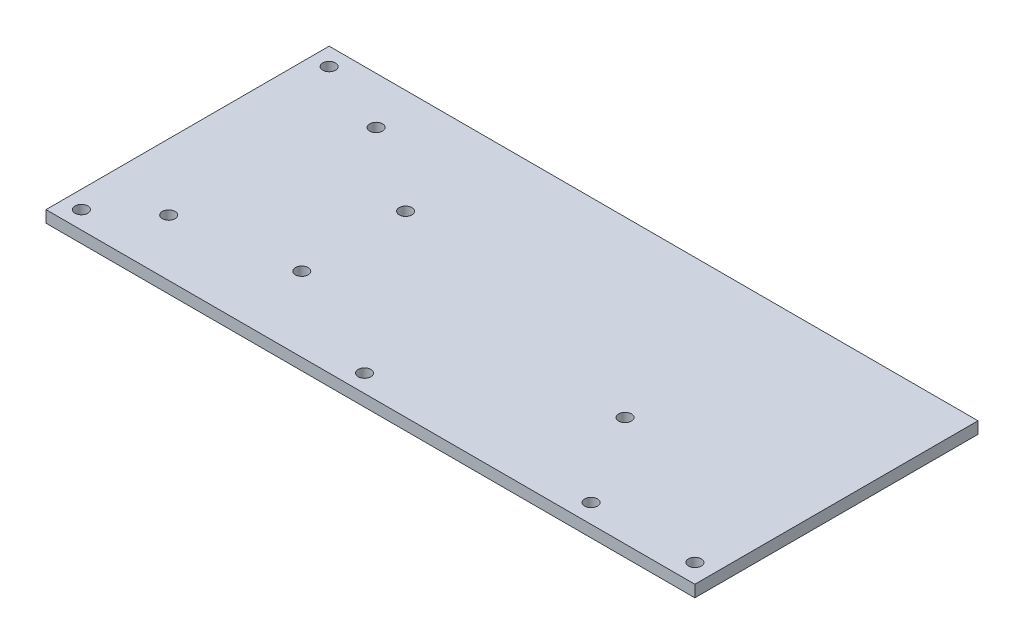
ISO-10303-21;
HEADER;
FILE_DESCRIPTION(('STEP AP214'),'2;1');
FILE_NAME('part.step','',(''),(''),'','','');
FILE_SCHEMA(('AUTOMOTIVE_DESIGN { 1 0 10303 214 1 1 1 1 }'));
ENDSEC;
DATA;
#1=APPLICATION_CONTEXT('core data for automotive mechanical design processes');
#2=APPLICATION_PROTOCOL_DEFINITION('international standard','automotive_design',2000,#1);
#3=PRODUCT_CONTEXT('',#1,'mechanical');
#4=PRODUCT('Part','Part','',(#3));
#5=PRODUCT_RELATED_PRODUCT_CATEGORY('part','',(#4));
#6=PRODUCT_DEFINITION_FORMATION('','',#4);
#7=PRODUCT_DEFINITION_CONTEXT('part definition',#1,'design');
#8=PRODUCT_DEFINITION('design','',#6,#7);
#9=PRODUCT_DEFINITION_SHAPE('','',#8);
#10=(LENGTH_UNIT() NAMED_UNIT(*) SI_UNIT(.MILLI.,.METRE.));
#11=(NAMED_UNIT(*) PLANE_ANGLE_UNIT() SI_UNIT($,.RADIAN.));
#12=(NAMED_UNIT(*) SI_UNIT($,.STERADIAN.) SOLID_ANGLE_UNIT());
#13=UNCERTAINTY_MEASURE_WITH_UNIT(LENGTH_MEASURE(1.E-05),#10,'distance_accuracy_value','');
#14=(GEOMETRIC_REPRESENTATION_CONTEXT(3) GLOBAL_UNCERTAINTY_ASSIGNED_CONTEXT((#13)) GLOBAL_UNIT_ASSIGNED_CONTEXT((#10,
#11,#12)) REPRESENTATION_CONTEXT('',''));
#15=CARTESIAN_POINT('',(0.,0.,0.));
#16=DIRECTION('',(0.,0.,1.));
#17=DIRECTION('',(1.,0.,0.));
#18=AXIS2_PLACEMENT_3D('',#15,#16,#17);
#19=CARTESIAN_POINT('',(87.3125,3.175,38.1));
#20=DIRECTION('',(-1.,0.,0.));
#21=DIRECTION('',(0.,0.,1.));
#22=AXIS2_PLACEMENT_3D('',#19,#20,#21);
#23=PLANE('',#22);
#24=DIRECTION('',(0.,0.,-1.));
#25=VECTOR('',#24,1.);
#26=CARTESIAN_POINT('',(87.3125,0.,38.1));
#27=LINE('',#26,#25);
#28=CARTESIAN_POINT('',(87.3125,0.,38.1));
#29=VERTEX_POINT('',#28);
#30=CARTESIAN_POINT('',(87.3125,0.,-38.1));
#31=VERTEX_POINT('',#30);
#32=EDGE_CURVE('E97',#29,#31,#27,.T.);
#33=ORIENTED_EDGE('',*,*,#32,.T.);
#34=DIRECTION('',(0.,-1.,0.));
#35=VECTOR('',#34,1.);
#36=CARTESIAN_POINT('',(87.3125,3.175,-38.1));
#37=LINE('',#36,#35);
#38=CARTESIAN_POINT('',(87.3125,3.175,-38.1));
#39=VERTEX_POINT('',#38);
#40=EDGE_CURVE('E11',#39,#31,#37,.T.);
#41=ORIENTED_EDGE('',*,*,#40,.F.);
#42=DIRECTION('',(0.,0.,-1.));
#43=VECTOR('',#42,1.);
#44=CARTESIAN_POINT('',(87.3125,3.175,38.1));
#45=LINE('',#44,#43);
#46=CARTESIAN_POINT('',(87.3125,3.175,38.1));
#47=VERTEX_POINT('',#46);
#48=EDGE_CURVE('E85',#47,#39,#45,.T.);
#49=ORIENTED_EDGE('',*,*,#48,.F.);
#50=DIRECTION('',(0.,-1.,0.));
#51=VECTOR('',#50,1.);
#52=CARTESIAN_POINT('',(87.3125,3.175,38.1));
#53=LINE('',#52,#51);
#54=EDGE_CURVE('E93',#47,#29,#53,.T.);
#55=ORIENTED_EDGE('',*,*,#54,.T.);
#56=EDGE_LOOP('',(#33,#41,#49,#55));
#57=FACE_BOUND('',#56,.T.);
#58=ADVANCED_FACE('F34',(#57),#23,.F.);
#59=CARTESIAN_POINT('',(-87.3125,3.175,-38.1));
#60=DIRECTION('',(0.,0.,1.));
#61=DIRECTION('',(1.,0.,0.));
#62=AXIS2_PLACEMENT_3D('',#59,#60,#61);
#63=PLANE('',#62);
#64=DIRECTION('',(-1.,0.,0.));
#65=VECTOR('',#64,1.);
#66=CARTESIAN_POINT('',(-87.3125,0.,-38.1));
#67=LINE('',#66,#65);
#68=CARTESIAN_POINT('',(-87.3125,0.,-38.1));
#69=VERTEX_POINT('',#68);
#70=EDGE_CURVE('E89',#31,#69,#67,.T.);
#71=ORIENTED_EDGE('',*,*,#70,.T.);
#72=DIRECTION('',(0.,-1.,0.));
#73=VECTOR('',#72,1.);
#74=CARTESIAN_POINT('',(-87.3125,3.175,-38.1));
#75=LINE('',#74,#73);
#76=CARTESIAN_POINT('',(-87.3125,3.175,-38.1));
#77=VERTEX_POINT('',#76);
#78=EDGE_CURVE('E42',#77,#69,#75,.T.);
#79=ORIENTED_EDGE('',*,*,#78,.F.);
#80=DIRECTION('',(-1.,0.,0.));
#81=VECTOR('',#80,1.);
#82=CARTESIAN_POINT('',(-87.3125,3.175,-38.1));
#83=LINE('',#82,#81);
#84=EDGE_CURVE('E80',#39,#77,#83,.T.);
#85=ORIENTED_EDGE('',*,*,#84,.F.);
#86=ORIENTED_EDGE('',*,*,#40,.T.);
#87=EDGE_LOOP('',(#71,#79,#85,#86));
#88=FACE_BOUND('',#87,.T.);
#89=ADVANCED_FACE('F88',(#88),#63,.F.);
#90=CARTESIAN_POINT('',(-87.3125,3.175,38.1));
#91=DIRECTION('',(1.,0.,0.));
#92=DIRECTION('',(0.,0.,-1.));
#93=AXIS2_PLACEMENT_3D('',#90,#91,#92);
#94=PLANE('',#93);
#95=DIRECTION('',(0.,0.,1.));
#96=VECTOR('',#95,1.);
#97=CARTESIAN_POINT('',(-87.3125,0.,38.1));
#98=LINE('',#97,#96);
#99=CARTESIAN_POINT('',(-87.3125,0.,38.1));
#100=VERTEX_POINT('',#99);
#101=EDGE_CURVE('E67',#69,#100,#98,.T.);
#102=ORIENTED_EDGE('',*,*,#101,.T.);
#103=DIRECTION('',(0.,-1.,0.));
#104=VECTOR('',#103,1.);
#105=CARTESIAN_POINT('',(-87.3125,3.175,38.1));
#106=LINE('',#105,#104);
#107=CARTESIAN_POINT('',(-87.3125,3.175,38.1));
#108=VERTEX_POINT('',#107);
#109=EDGE_CURVE('E90',#108,#100,#106,.T.);
#110=ORIENTED_EDGE('',*,*,#109,.F.);
#111=DIRECTION('',(0.,0.,1.));
#112=VECTOR('',#111,1.);
#113=CARTESIAN_POINT('',(-87.3125,3.175,38.1));
#114=LINE('',#113,#112);
#115=EDGE_CURVE('E83',#77,#108,#114,.T.);
#116=ORIENTED_EDGE('',*,*,#115,.F.);
#117=ORIENTED_EDGE('',*,*,#78,.T.);
#118=EDGE_LOOP('',(#102,#110,#116,#117));
#119=FACE_BOUND('',#118,.T.);
#120=ADVANCED_FACE('F91',(#119),#94,.F.);
#121=CARTESIAN_POINT('',(-87.3125,3.175,38.1));
#122=DIRECTION('',(0.,0.,-1.));
#123=DIRECTION('',(-1.,0.,0.));
#124=AXIS2_PLACEMENT_3D('',#121,#122,#123);
#125=PLANE('',#124);
#126=DIRECTION('',(1.,0.,0.));
#127=VECTOR('',#126,1.);
#128=CARTESIAN_POINT('',(-87.3125,0.,38.1));
#129=LINE('',#128,#127);
#130=EDGE_CURVE('E73',#100,#29,#129,.T.);
#131=ORIENTED_EDGE('',*,*,#130,.T.);
#132=ORIENTED_EDGE('',*,*,#54,.F.);
#133=DIRECTION('',(1.,0.,0.));
#134=VECTOR('',#133,1.);
#135=CARTESIAN_POINT('',(-87.3125,3.175,38.1));
#136=LINE('',#135,#134);
#137=EDGE_CURVE('E50',#108,#47,#136,.T.);
#138=ORIENTED_EDGE('',*,*,#137,.F.);
#139=ORIENTED_EDGE('',*,*,#109,.T.);
#140=EDGE_LOOP('',(#131,#132,#138,#139));
#141=FACE_BOUND('',#140,.T.);
#142=ADVANCED_FACE('F105',(#141),#125,.F.);
#143=CARTESIAN_POINT('',(0.,3.175,0.));
#144=DIRECTION('',(0.,-1.,0.));
#145=DIRECTION('',(0.,0.,-1.));
#146=AXIS2_PLACEMENT_3D('',#143,#144,#145);
#147=PLANE('',#146);
#148=CARTESIAN_POINT('',(39.0525,3.175,8.636));
#149=DIRECTION('',(0.,1.,0.));
#150=DIRECTION('',(0.,0.,1.));
#151=AXIS2_PLACEMENT_3D('',#148,#149,#150);
#152=CIRCLE('',#151,1.7145);
#153=CARTESIAN_POINT('',(39.0525,3.175,10.3505));
#154=VERTEX_POINT('',#153);
#155=EDGE_CURVE('E162',#154,#154,#152,.T.);
#156=ORIENTED_EDGE('',*,*,#155,.F.);
#157=EDGE_LOOP('',(#156));
#158=FACE_BOUND('',#157,.T.);
#159=CARTESIAN_POINT('',(54.2925,3.175,33.02));
#160=DIRECTION('',(0.,1.,0.));
#161=DIRECTION('',(0.,0.,1.));
#162=AXIS2_PLACEMENT_3D('',#159,#160,#161);
#163=CIRCLE('',#162,1.7145);
#164=CARTESIAN_POINT('',(54.2925,3.175,34.7345));
#165=VERTEX_POINT('',#164);
#166=EDGE_CURVE('E156',#165,#165,#163,.T.);
#167=ORIENTED_EDGE('',*,*,#166,.F.);
#168=EDGE_LOOP('',(#167));
#169=FACE_BOUND('',#168,.T.);
#170=CARTESIAN_POINT('',(82.2325,3.175,33.02));
#171=DIRECTION('',(0.,1.,0.));
#172=DIRECTION('',(0.,0.,1.));
#173=AXIS2_PLACEMENT_3D('',#170,#171,#172);
#174=CIRCLE('',#173,1.7145);
#175=CARTESIAN_POINT('',(82.2325,3.175,34.7345));
#176=VERTEX_POINT('',#175);
#177=EDGE_CURVE('E150',#176,#176,#174,.T.);
#178=ORIENTED_EDGE('',*,*,#177,.F.);
#179=EDGE_LOOP('',(#178));
#180=FACE_BOUND('',#179,.T.);
#181=CARTESIAN_POINT('',(-62.0395,3.175,-25.4762));
#182=DIRECTION('',(0.,1.,0.));
#183=DIRECTION('',(0.,0.,1.));
#184=AXIS2_PLACEMENT_3D('',#181,#182,#183);
#185=CIRCLE('',#184,1.7145);
#186=CARTESIAN_POINT('',(-62.0395,3.175,-23.7617));
#187=VERTEX_POINT('',#186);
#188=EDGE_CURVE('E144',#187,#187,#185,.T.);
#189=ORIENTED_EDGE('',*,*,#188,.F.);
#190=EDGE_LOOP('',(#189));
#191=FACE_BOUND('',#190,.T.);
#192=CARTESIAN_POINT('',(-69.5325,3.175,22.86));
#193=DIRECTION('',(0.,1.,0.));
#194=DIRECTION('',(0.,0.,1.));
#195=AXIS2_PLACEMENT_3D('',#192,#193,#194);
#196=CIRCLE('',#195,1.7145);
#197=CARTESIAN_POINT('',(-69.5325,3.175,24.5745));
#198=VERTEX_POINT('',#197);
#199=EDGE_CURVE('E138',#198,#198,#196,.T.);
#200=ORIENTED_EDGE('',*,*,#199,.F.);
#201=EDGE_LOOP('',(#200));
#202=FACE_BOUND('',#201,.T.);
#203=CARTESIAN_POINT('',(-38.5445,3.175,-9.906));
#204=DIRECTION('',(0.,1.,0.));
#205=DIRECTION('',(0.,0.,1.));
#206=AXIS2_PLACEMENT_3D('',#203,#204,#205);
#207=CIRCLE('',#206,1.7145);
#208=CARTESIAN_POINT('',(-38.5445,3.175,-8.1915));
#209=VERTEX_POINT('',#208);
#210=EDGE_CURVE('E132',#209,#209,#207,.T.);
#211=ORIENTED_EDGE('',*,*,#210,.F.);
#212=EDGE_LOOP('',(#211));
#213=FACE_BOUND('',#212,.T.);
#214=CARTESIAN_POINT('',(-38.5445,3.175,18.034));
#215=DIRECTION('',(0.,1.,0.));
#216=DIRECTION('',(0.,0.,1.));
#217=AXIS2_PLACEMENT_3D('',#214,#215,#216);
#218=CIRCLE('',#217,1.7145);
#219=CARTESIAN_POINT('',(-38.5445,3.175,19.7485));
#220=VERTEX_POINT('',#219);
#221=EDGE_CURVE('E126',#220,#220,#218,.T.);
#222=ORIENTED_EDGE('',*,*,#221,.F.);
#223=EDGE_LOOP('',(#222));
#224=FACE_BOUND('',#223,.T.);
#225=CARTESIAN_POINT('',(-6.35000000000004,3.175,33.3375));
#226=DIRECTION('',(0.,1.,0.));
#227=DIRECTION('',(0.,0.,1.));
#228=AXIS2_PLACEMENT_3D('',#225,#226,#227);
#229=CIRCLE('',#228,1.7145);
#230=CARTESIAN_POINT('',(-6.35000000000004,3.175,35.052));
#231=VERTEX_POINT('',#230);
#232=EDGE_CURVE('E120',#231,#231,#229,.T.);
#233=ORIENTED_EDGE('',*,*,#232,.F.);
#234=EDGE_LOOP('',(#233));
#235=FACE_BOUND('',#234,.T.);
#236=CARTESIAN_POINT('',(-82.55,3.175,33.3375));
#237=DIRECTION('',(0.,1.,0.));
#238=DIRECTION('',(0.,0.,1.));
#239=AXIS2_PLACEMENT_3D('',#236,#237,#238);
#240=CIRCLE('',#239,1.7145);
#241=CARTESIAN_POINT('',(-82.55,3.175,35.052));
#242=VERTEX_POINT('',#241);
#243=EDGE_CURVE('E114',#242,#242,#240,.T.);
#244=ORIENTED_EDGE('',*,*,#243,.F.);
#245=EDGE_LOOP('',(#244));
#246=FACE_BOUND('',#245,.T.);
#247=CARTESIAN_POINT('',(-82.55,3.175,-33.3375));
#248=DIRECTION('',(0.,1.,0.));
#249=DIRECTION('',(0.,0.,1.));
#250=AXIS2_PLACEMENT_3D('',#247,#248,#249);
#251=CIRCLE('',#250,1.7145);
#252=CARTESIAN_POINT('',(-82.55,3.175,-31.623));
#253=VERTEX_POINT('',#252);
#254=EDGE_CURVE('E100',#253,#253,#251,.T.);
#255=ORIENTED_EDGE('',*,*,#254,.F.);
#256=EDGE_LOOP('',(#255));
#257=FACE_BOUND('',#256,.T.);
#258=ORIENTED_EDGE('',*,*,#48,.T.);
#259=ORIENTED_EDGE('',*,*,#84,.T.);
#260=ORIENTED_EDGE('',*,*,#115,.T.);
#261=ORIENTED_EDGE('',*,*,#137,.T.);
#262=EDGE_LOOP('',(#258,#259,#260,#261));
#263=FACE_BOUND('',#262,.T.);
#264=ADVANCED_FACE('F81',(#158,#169,#180,#191,#202,#213,#224,#235,#246,#257,#263),#147,.F.);
#265=CARTESIAN_POINT('',(0.,0.,0.));
#266=DIRECTION('',(0.,-1.,0.));
#267=DIRECTION('',(0.,0.,-1.));
#268=AXIS2_PLACEMENT_3D('',#265,#266,#267);
#269=PLANE('',#268);
#270=CARTESIAN_POINT('',(39.0525,0.,8.636));
#271=DIRECTION('',(0.,-1.,0.));
#272=DIRECTION('',(0.,0.,-1.));
#273=AXIS2_PLACEMENT_3D('',#270,#271,#272);
#274=CIRCLE('',#273,1.7145);
#275=CARTESIAN_POINT('',(39.0525,0.,6.9215));
#276=VERTEX_POINT('',#275);
#277=EDGE_CURVE('E165',#276,#276,#274,.F.);
#278=ORIENTED_EDGE('',*,*,#277,.T.);
#279=EDGE_LOOP('',(#278));
#280=FACE_BOUND('',#279,.T.);
#281=CARTESIAN_POINT('',(54.2925,0.,33.02));
#282=DIRECTION('',(0.,-1.,0.));
#283=DIRECTION('',(0.,0.,-1.));
#284=AXIS2_PLACEMENT_3D('',#281,#282,#283);
#285=CIRCLE('',#284,1.7145);
#286=CARTESIAN_POINT('',(54.2925,0.,31.3055));
#287=VERTEX_POINT('',#286);
#288=EDGE_CURVE('E159',#287,#287,#285,.F.);
#289=ORIENTED_EDGE('',*,*,#288,.T.);
#290=EDGE_LOOP('',(#289));
#291=FACE_BOUND('',#290,.T.);
#292=CARTESIAN_POINT('',(82.2325,0.,33.02));
#293=DIRECTION('',(0.,-1.,0.));
#294=DIRECTION('',(0.,0.,-1.));
#295=AXIS2_PLACEMENT_3D('',#292,#293,#294);
#296=CIRCLE('',#295,1.7145);
#297=CARTESIAN_POINT('',(82.2325,0.,31.3055));
#298=VERTEX_POINT('',#297);
#299=EDGE_CURVE('E153',#298,#298,#296,.F.);
#300=ORIENTED_EDGE('',*,*,#299,.T.);
#301=EDGE_LOOP('',(#300));
#302=FACE_BOUND('',#301,.T.);
#303=CARTESIAN_POINT('',(-62.0395,0.,-25.4762));
#304=DIRECTION('',(0.,-1.,0.));
#305=DIRECTION('',(0.,0.,-1.));
#306=AXIS2_PLACEMENT_3D('',#303,#304,#305);
#307=CIRCLE('',#306,1.7145);
#308=CARTESIAN_POINT('',(-62.0395,0.,-27.1907));
#309=VERTEX_POINT('',#308);
#310=EDGE_CURVE('E147',#309,#309,#307,.F.);
#311=ORIENTED_EDGE('',*,*,#310,.T.);
#312=EDGE_LOOP('',(#311));
#313=FACE_BOUND('',#312,.T.);
#314=CARTESIAN_POINT('',(-69.5325,0.,22.86));
#315=DIRECTION('',(0.,-1.,0.));
#316=DIRECTION('',(0.,0.,-1.));
#317=AXIS2_PLACEMENT_3D('',#314,#315,#316);
#318=CIRCLE('',#317,1.7145);
#319=CARTESIAN_POINT('',(-69.5325,0.,21.1455));
#320=VERTEX_POINT('',#319);
#321=EDGE_CURVE('E141',#320,#320,#318,.F.);
#322=ORIENTED_EDGE('',*,*,#321,.T.);
#323=EDGE_LOOP('',(#322));
#324=FACE_BOUND('',#323,.T.);
#325=CARTESIAN_POINT('',(-38.5445,0.,-9.906));
#326=DIRECTION('',(0.,-1.,0.));
#327=DIRECTION('',(0.,0.,-1.));
#328=AXIS2_PLACEMENT_3D('',#325,#326,#327);
#329=CIRCLE('',#328,1.7145);
#330=CARTESIAN_POINT('',(-38.5445,0.,-11.6205));
#331=VERTEX_POINT('',#330);
#332=EDGE_CURVE('E135',#331,#331,#329,.F.);
#333=ORIENTED_EDGE('',*,*,#332,.T.);
#334=EDGE_LOOP('',(#333));
#335=FACE_BOUND('',#334,.T.);
#336=CARTESIAN_POINT('',(-38.5445,0.,18.034));
#337=DIRECTION('',(0.,-1.,0.));
#338=DIRECTION('',(0.,0.,-1.));
#339=AXIS2_PLACEMENT_3D('',#336,#337,#338);
#340=CIRCLE('',#339,1.7145);
#341=CARTESIAN_POINT('',(-38.5445,0.,16.3195));
#342=VERTEX_POINT('',#341);
#343=EDGE_CURVE('E129',#342,#342,#340,.F.);
#344=ORIENTED_EDGE('',*,*,#343,.T.);
#345=EDGE_LOOP('',(#344));
#346=FACE_BOUND('',#345,.T.);
#347=CARTESIAN_POINT('',(-6.35000000000004,0.,33.3375));
#348=DIRECTION('',(0.,-1.,0.));
#349=DIRECTION('',(0.,0.,-1.));
#350=AXIS2_PLACEMENT_3D('',#347,#348,#349);
#351=CIRCLE('',#350,1.7145);
#352=CARTESIAN_POINT('',(-6.35000000000004,0.,31.623));
#353=VERTEX_POINT('',#352);
#354=EDGE_CURVE('E123',#353,#353,#351,.F.);
#355=ORIENTED_EDGE('',*,*,#354,.T.);
#356=EDGE_LOOP('',(#355));
#357=FACE_BOUND('',#356,.T.);
#358=CARTESIAN_POINT('',(-82.55,0.,33.3375));
#359=DIRECTION('',(0.,-1.,0.));
#360=DIRECTION('',(0.,0.,-1.));
#361=AXIS2_PLACEMENT_3D('',#358,#359,#360);
#362=CIRCLE('',#361,1.7145);
#363=CARTESIAN_POINT('',(-82.55,0.,31.623));
#364=VERTEX_POINT('',#363);
#365=EDGE_CURVE('E117',#364,#364,#362,.F.);
#366=ORIENTED_EDGE('',*,*,#365,.T.);
#367=EDGE_LOOP('',(#366));
#368=FACE_BOUND('',#367,.T.);
#369=CARTESIAN_POINT('',(-82.55,0.,-33.3375));
#370=DIRECTION('',(0.,-1.,0.));
#371=DIRECTION('',(0.,0.,-1.));
#372=AXIS2_PLACEMENT_3D('',#369,#370,#371);
#373=CIRCLE('',#372,1.7145);
#374=CARTESIAN_POINT('',(-82.55,0.,-35.052));
#375=VERTEX_POINT('',#374);
#376=EDGE_CURVE('E111',#375,#375,#373,.F.);
#377=ORIENTED_EDGE('',*,*,#376,.T.);
#378=EDGE_LOOP('',(#377));
#379=FACE_BOUND('',#378,.T.);
#380=ORIENTED_EDGE('',*,*,#32,.F.);
#381=ORIENTED_EDGE('',*,*,#130,.F.);
#382=ORIENTED_EDGE('',*,*,#101,.F.);
#383=ORIENTED_EDGE('',*,*,#70,.F.);
#384=EDGE_LOOP('',(#380,#381,#382,#383));
#385=FACE_BOUND('',#384,.T.);
#386=ADVANCED_FACE('F108',(#280,#291,#302,#313,#324,#335,#346,#357,#368,#379,#385),#269,.T.);
#387=CARTESIAN_POINT('',(-82.55,-0.00100000000000013,-33.3375));
#388=DIRECTION('',(0.,1.,0.));
#389=DIRECTION('',(0.,0.,1.));
#390=AXIS2_PLACEMENT_3D('',#387,#388,#389);
#391=CYLINDRICAL_SURFACE('',#390,1.7145);
#392=ORIENTED_EDGE('',*,*,#376,.F.);
#393=EDGE_LOOP('',(#392));
#394=FACE_BOUND('',#393,.T.);
#395=ORIENTED_EDGE('',*,*,#254,.T.);
#396=EDGE_LOOP('',(#395));
#397=FACE_BOUND('',#396,.T.);
#398=ADVANCED_FACE('F194',(#394,#397),#391,.F.);
#399=CARTESIAN_POINT('',(-82.55,-0.00100000000000013,33.3375));
#400=DIRECTION('',(0.,1.,0.));
#401=DIRECTION('',(0.,0.,1.));
#402=AXIS2_PLACEMENT_3D('',#399,#400,#401);
#403=CYLINDRICAL_SURFACE('',#402,1.7145);
#404=ORIENTED_EDGE('',*,*,#365,.F.);
#405=EDGE_LOOP('',(#404));
#406=FACE_BOUND('',#405,.T.);
#407=ORIENTED_EDGE('',*,*,#243,.T.);
#408=EDGE_LOOP('',(#407));
#409=FACE_BOUND('',#408,.T.);
#410=ADVANCED_FACE('F196',(#406,#409),#403,.F.);
#411=CARTESIAN_POINT('',(-6.35000000000004,-0.00100000000000013,33.3375));
#412=DIRECTION('',(0.,1.,0.));
#413=DIRECTION('',(0.,0.,1.));
#414=AXIS2_PLACEMENT_3D('',#411,#412,#413);
#415=CYLINDRICAL_SURFACE('',#414,1.7145);
#416=ORIENTED_EDGE('',*,*,#354,.F.);
#417=EDGE_LOOP('',(#416));
#418=FACE_BOUND('',#417,.T.);
#419=ORIENTED_EDGE('',*,*,#232,.T.);
#420=EDGE_LOOP('',(#419));
#421=FACE_BOUND('',#420,.T.);
#422=ADVANCED_FACE('F203',(#418,#421),#415,.F.);
#423=CARTESIAN_POINT('',(-38.5445,-0.00100000000000013,18.034));
#424=DIRECTION('',(0.,1.,0.));
#425=DIRECTION('',(0.,0.,1.));
#426=AXIS2_PLACEMENT_3D('',#423,#424,#425);
#427=CYLINDRICAL_SURFACE('',#426,1.7145);
#428=ORIENTED_EDGE('',*,*,#343,.F.);
#429=EDGE_LOOP('',(#428));
#430=FACE_BOUND('',#429,.T.);
#431=ORIENTED_EDGE('',*,*,#221,.T.);
#432=EDGE_LOOP('',(#431));
#433=FACE_BOUND('',#432,.T.);
#434=ADVANCED_FACE('F280',(#430,#433),#427,.F.);
#435=CARTESIAN_POINT('',(-38.5445,-0.00100000000000013,-9.906));
#436=DIRECTION('',(0.,1.,0.));
#437=DIRECTION('',(0.,0.,1.));
#438=AXIS2_PLACEMENT_3D('',#435,#436,#437);
#439=CYLINDRICAL_SURFACE('',#438,1.7145);
#440=ORIENTED_EDGE('',*,*,#332,.F.);
#441=EDGE_LOOP('',(#440));
#442=FACE_BOUND('',#441,.T.);
#443=ORIENTED_EDGE('',*,*,#210,.T.);
#444=EDGE_LOOP('',(#443));
#445=FACE_BOUND('',#444,.T.);
#446=ADVANCED_FACE('F276',(#442,#445),#439,.F.);
#447=CARTESIAN_POINT('',(-69.5325,-0.00100000000000013,22.86));
#448=DIRECTION('',(0.,1.,0.));
#449=DIRECTION('',(0.,0.,1.));
#450=AXIS2_PLACEMENT_3D('',#447,#448,#449);
#451=CYLINDRICAL_SURFACE('',#450,1.7145);
#452=ORIENTED_EDGE('',*,*,#321,.F.);
#453=EDGE_LOOP('',(#452));
#454=FACE_BOUND('',#453,.T.);
#455=ORIENTED_EDGE('',*,*,#199,.T.);
#456=EDGE_LOOP('',(#455));
#457=FACE_BOUND('',#456,.T.);
#458=ADVANCED_FACE('F272',(#454,#457),#451,.F.);
#459=CARTESIAN_POINT('',(-62.0395,-0.00100000000000013,-25.4762));
#460=DIRECTION('',(0.,1.,0.));
#461=DIRECTION('',(0.,0.,1.));
#462=AXIS2_PLACEMENT_3D('',#459,#460,#461);
#463=CYLINDRICAL_SURFACE('',#462,1.7145);
#464=ORIENTED_EDGE('',*,*,#310,.F.);
#465=EDGE_LOOP('',(#464));
#466=FACE_BOUND('',#465,.T.);
#467=ORIENTED_EDGE('',*,*,#188,.T.);
#468=EDGE_LOOP('',(#467));
#469=FACE_BOUND('',#468,.T.);
#470=ADVANCED_FACE('F244',(#466,#469),#463,.F.);
#471=CARTESIAN_POINT('',(82.2325,-0.00100000000000013,33.02));
#472=DIRECTION('',(0.,1.,0.));
#473=DIRECTION('',(0.,0.,1.));
#474=AXIS2_PLACEMENT_3D('',#471,#472,#473);
#475=CYLINDRICAL_SURFACE('',#474,1.7145);
#476=ORIENTED_EDGE('',*,*,#299,.F.);
#477=EDGE_LOOP('',(#476));
#478=FACE_BOUND('',#477,.T.);
#479=ORIENTED_EDGE('',*,*,#177,.T.);
#480=EDGE_LOOP('',(#479));
#481=FACE_BOUND('',#480,.T.);
#482=ADVANCED_FACE('F238',(#478,#481),#475,.F.);
#483=CARTESIAN_POINT('',(54.2925,-0.00100000000000013,33.02));
#484=DIRECTION('',(0.,1.,0.));
#485=DIRECTION('',(0.,0.,1.));
#486=AXIS2_PLACEMENT_3D('',#483,#484,#485);
#487=CYLINDRICAL_SURFACE('',#486,1.7145);
#488=ORIENTED_EDGE('',*,*,#288,.F.);
#489=EDGE_LOOP('',(#488));
#490=FACE_BOUND('',#489,.T.);
#491=ORIENTED_EDGE('',*,*,#166,.T.);
#492=EDGE_LOOP('',(#491));
#493=FACE_BOUND('',#492,.T.);
#494=ADVANCED_FACE('F243',(#490,#493),#487,.F.);
#495=CARTESIAN_POINT('',(39.0525,-0.00100000000000013,8.636));
#496=DIRECTION('',(0.,1.,0.));
#497=DIRECTION('',(0.,0.,1.));
#498=AXIS2_PLACEMENT_3D('',#495,#496,#497);
#499=CYLINDRICAL_SURFACE('',#498,1.7145);
#500=ORIENTED_EDGE('',*,*,#277,.F.);
#501=EDGE_LOOP('',(#500));
#502=FACE_BOUND('',#501,.T.);
#503=ORIENTED_EDGE('',*,*,#155,.T.);
#504=EDGE_LOOP('',(#503));
#505=FACE_BOUND('',#504,.T.);
#506=ADVANCED_FACE('F171',(#502,#505),#499,.F.);
#507=CLOSED_SHELL('',(#58,#89,#120,#142,#264,#386,#398,#410,#422,#434,#446,#458,#470,#482,#494,#506));
#508=MANIFOLD_SOLID_BREP('B2',#507);
#509=ADVANCED_BREP_SHAPE_REPRESENTATION('',(#18,#508),#14);
#510=SHAPE_DEFINITION_REPRESENTATION(#9,#509);
ENDSEC;
END-ISO-10303-21;
